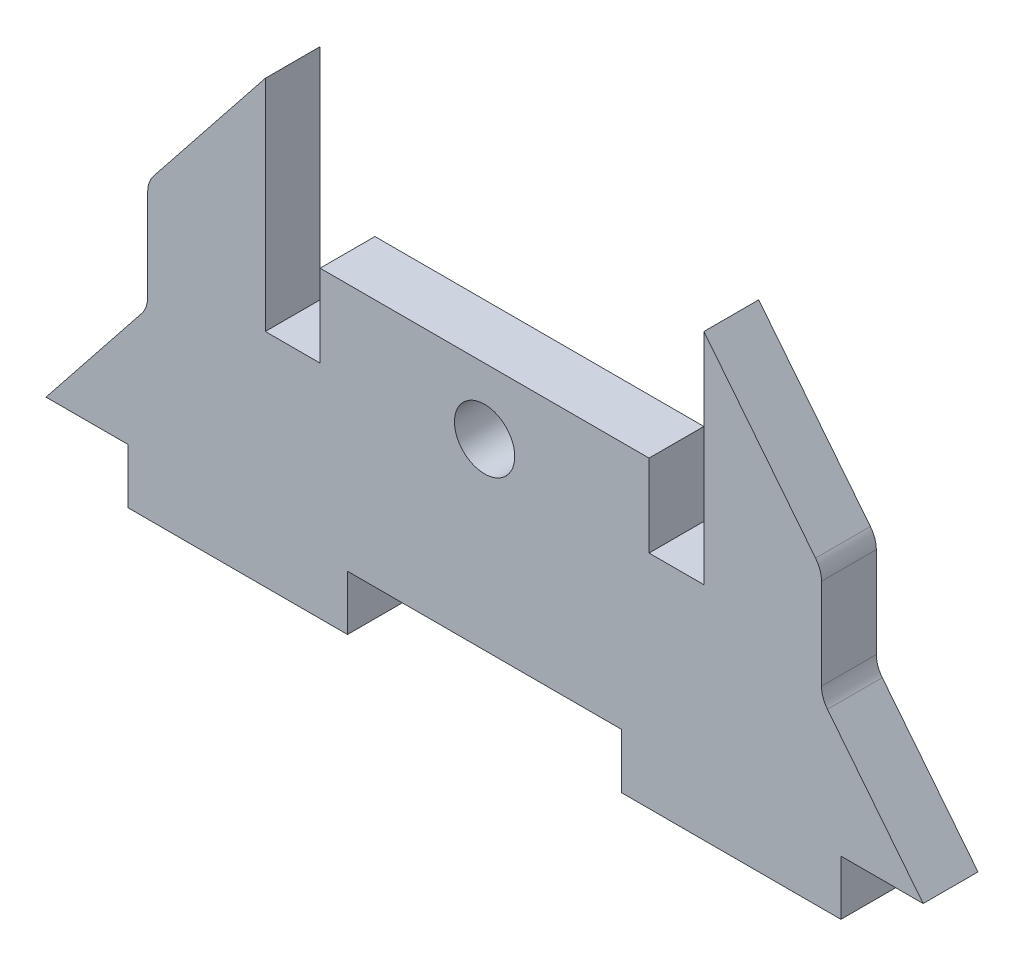
ISO-10303-21;
HEADER;
FILE_DESCRIPTION(('STEP AP214'),'2;1');
FILE_NAME('part.step','',(''),(''),'','','');
FILE_SCHEMA(('AUTOMOTIVE_DESIGN { 1 0 10303 214 1 1 1 1 }'));
ENDSEC;
DATA;
#1=APPLICATION_CONTEXT('core data for automotive mechanical design processes');
#2=APPLICATION_PROTOCOL_DEFINITION('international standard','automotive_design',2000,#1);
#3=PRODUCT_CONTEXT('',#1,'mechanical');
#4=PRODUCT('Part','Part','',(#3));
#5=PRODUCT_RELATED_PRODUCT_CATEGORY('part','',(#4));
#6=PRODUCT_DEFINITION_FORMATION('','',#4);
#7=PRODUCT_DEFINITION_CONTEXT('part definition',#1,'design');
#8=PRODUCT_DEFINITION('design','',#6,#7);
#9=PRODUCT_DEFINITION_SHAPE('','',#8);
#10=(LENGTH_UNIT() NAMED_UNIT(*) SI_UNIT(.MILLI.,.METRE.));
#11=(NAMED_UNIT(*) PLANE_ANGLE_UNIT() SI_UNIT($,.RADIAN.));
#12=(NAMED_UNIT(*) SI_UNIT($,.STERADIAN.) SOLID_ANGLE_UNIT());
#13=UNCERTAINTY_MEASURE_WITH_UNIT(LENGTH_MEASURE(1.E-05),#10,'distance_accuracy_value','');
#14=(GEOMETRIC_REPRESENTATION_CONTEXT(3) GLOBAL_UNCERTAINTY_ASSIGNED_CONTEXT((#13)) GLOBAL_UNIT_ASSIGNED_CONTEXT((#10,
#11,#12)) REPRESENTATION_CONTEXT('',''));
#15=CARTESIAN_POINT('',(0.,0.,0.));
#16=DIRECTION('',(0.,0.,1.));
#17=DIRECTION('',(1.,0.,0.));
#18=AXIS2_PLACEMENT_3D('',#15,#16,#17);
#19=CARTESIAN_POINT('',(-13.2909899684622,-1.66008532234719,2.));
#20=DIRECTION('',(0.,0.,1.));
#21=DIRECTION('',(1.,0.,0.));
#22=AXIS2_PLACEMENT_3D('',#19,#20,#21);
#23=PLANE('',#22);
#24=CARTESIAN_POINT('',(-13.2909899684622,-1.66008532234719,2.));
#25=DIRECTION('',(0.,0.,-1.));
#26=DIRECTION('',(1.,0.,0.));
#27=AXIS2_PLACEMENT_3D('',#24,#25,#26);
#28=CIRCLE('',#27,0.999999999999997);
#29=CARTESIAN_POINT('',(-12.2909899684622,-1.66008532234719,2.));
#30=VERTEX_POINT('',#29);
#31=CARTESIAN_POINT('',(-12.5082551235292,-2.28244065696539,2.));
#32=VERTEX_POINT('',#31);
#33=EDGE_CURVE('E294',#30,#32,#28,.T.);
#34=ORIENTED_EDGE('',*,*,#33,.T.);
#35=DIRECTION('',(-0.622355334618193,-0.782734844932993,0.));
#36=VECTOR('',#35,1.);
#37=CARTESIAN_POINT('',(-12.5082551235292,-2.28244065696539,2.));
#38=LINE('',#37,#36);
#39=CARTESIAN_POINT('',(-16.,-6.67399999999999,2.));
#40=VERTEX_POINT('',#39);
#41=EDGE_CURVE('E150',#32,#40,#38,.T.);
#42=ORIENTED_EDGE('',*,*,#41,.T.);
#43=DIRECTION('',(1.,0.,0.));
#44=VECTOR('',#43,1.);
#45=CARTESIAN_POINT('',(-13.,-6.67399999999999,2.));
#46=LINE('',#45,#44);
#47=CARTESIAN_POINT('',(-13.,-6.67399999999999,2.));
#48=VERTEX_POINT('',#47);
#49=EDGE_CURVE('E363',#40,#48,#46,.T.);
#50=ORIENTED_EDGE('',*,*,#49,.T.);
#51=DIRECTION('',(0.,-1.,0.));
#52=VECTOR('',#51,1.);
#53=CARTESIAN_POINT('',(-13.,-8.67399999999998,2.));
#54=LINE('',#53,#52);
#55=CARTESIAN_POINT('',(-13.,-8.67399999999998,2.));
#56=VERTEX_POINT('',#55);
#57=EDGE_CURVE('E382',#48,#56,#54,.T.);
#58=ORIENTED_EDGE('',*,*,#57,.T.);
#59=DIRECTION('',(1.,0.,0.));
#60=VECTOR('',#59,1.);
#61=CARTESIAN_POINT('',(-5.,-8.67399999999998,2.));
#62=LINE('',#61,#60);
#63=CARTESIAN_POINT('',(-5.,-8.67399999999998,2.));
#64=VERTEX_POINT('',#63);
#65=EDGE_CURVE('E379',#56,#64,#62,.T.);
#66=ORIENTED_EDGE('',*,*,#65,.T.);
#67=DIRECTION('',(0.,1.,0.));
#68=VECTOR('',#67,1.);
#69=CARTESIAN_POINT('',(-5.,-8.67399999999998,2.));
#70=LINE('',#69,#68);
#71=CARTESIAN_POINT('',(-5.,-6.67399999999998,2.));
#72=VERTEX_POINT('',#71);
#73=EDGE_CURVE('E381',#64,#72,#70,.T.);
#74=ORIENTED_EDGE('',*,*,#73,.T.);
#75=DIRECTION('',(1.,0.,0.));
#76=VECTOR('',#75,1.);
#77=CARTESIAN_POINT('',(5.,-6.67399999999998,2.));
#78=LINE('',#77,#76);
#79=CARTESIAN_POINT('',(5.,-6.67399999999998,2.));
#80=VERTEX_POINT('',#79);
#81=EDGE_CURVE('E384',#72,#80,#78,.T.);
#82=ORIENTED_EDGE('',*,*,#81,.T.);
#83=DIRECTION('',(0.,-1.,0.));
#84=VECTOR('',#83,1.);
#85=CARTESIAN_POINT('',(5.,-8.67399999999998,2.));
#86=LINE('',#85,#84);
#87=CARTESIAN_POINT('',(5.,-8.67399999999998,2.));
#88=VERTEX_POINT('',#87);
#89=EDGE_CURVE('E390',#80,#88,#86,.T.);
#90=ORIENTED_EDGE('',*,*,#89,.T.);
#91=DIRECTION('',(1.,0.,0.));
#92=VECTOR('',#91,1.);
#93=CARTESIAN_POINT('',(5.,-8.67399999999998,2.));
#94=LINE('',#93,#92);
#95=CARTESIAN_POINT('',(13.,-8.67399999999998,2.));
#96=VERTEX_POINT('',#95);
#97=EDGE_CURVE('E392',#88,#96,#94,.T.);
#98=ORIENTED_EDGE('',*,*,#97,.T.);
#99=DIRECTION('',(0.,1.,0.));
#100=VECTOR('',#99,1.);
#101=CARTESIAN_POINT('',(13.,-8.67399999999998,2.));
#102=LINE('',#101,#100);
#103=CARTESIAN_POINT('',(13.,-6.67399999999999,2.));
#104=VERTEX_POINT('',#103);
#105=EDGE_CURVE('E394',#96,#104,#102,.T.);
#106=ORIENTED_EDGE('',*,*,#105,.T.);
#107=DIRECTION('',(1.,0.,0.));
#108=VECTOR('',#107,1.);
#109=CARTESIAN_POINT('',(13.,-6.67399999999999,2.));
#110=LINE('',#109,#108);
#111=CARTESIAN_POINT('',(16.,-6.67399999999999,2.));
#112=VERTEX_POINT('',#111);
#113=EDGE_CURVE('E396',#104,#112,#110,.T.);
#114=ORIENTED_EDGE('',*,*,#113,.T.);
#115=DIRECTION('',(-0.622355334618194,0.782734844932993,0.));
#116=VECTOR('',#115,1.);
#117=CARTESIAN_POINT('',(12.5082551235292,-2.28244065696539,2.));
#118=LINE('',#117,#116);
#119=CARTESIAN_POINT('',(12.5082551235292,-2.28244065696539,2.));
#120=VERTEX_POINT('',#119);
#121=EDGE_CURVE('E398',#112,#120,#118,.T.);
#122=ORIENTED_EDGE('',*,*,#121,.T.);
#123=CARTESIAN_POINT('',(13.2909899684622,-1.66008532234719,2.));
#124=DIRECTION('',(0.,0.,-1.));
#125=DIRECTION('',(1.,0.,0.));
#126=AXIS2_PLACEMENT_3D('',#123,#124,#125);
#127=CIRCLE('',#126,0.999999999999998);
#128=CARTESIAN_POINT('',(12.2909899684622,-1.66008532234719,2.));
#129=VERTEX_POINT('',#128);
#130=EDGE_CURVE('E400',#120,#129,#127,.T.);
#131=ORIENTED_EDGE('',*,*,#130,.T.);
#132=DIRECTION('',(0.,1.,0.));
#133=VECTOR('',#132,1.);
#134=CARTESIAN_POINT('',(12.2909899684622,1.6541305204139,2.));
#135=LINE('',#134,#133);
#136=CARTESIAN_POINT('',(12.2909899684622,1.6541305204139,2.));
#137=VERTEX_POINT('',#136);
#138=EDGE_CURVE('E402',#129,#137,#135,.T.);
#139=ORIENTED_EDGE('',*,*,#138,.T.);
#140=CARTESIAN_POINT('',(11.2909899684622,1.6541305204139,2.));
#141=DIRECTION('',(0.,0.,1.));
#142=DIRECTION('',(-1.,0.,0.));
#143=AXIS2_PLACEMENT_3D('',#140,#141,#142);
#144=CIRCLE('',#143,0.999999999999999);
#145=CARTESIAN_POINT('',(12.0737248133952,2.2764858550321,2.));
#146=VERTEX_POINT('',#145);
#147=EDGE_CURVE('E404',#137,#146,#144,.T.);
#148=ORIENTED_EDGE('',*,*,#147,.T.);
#149=DIRECTION('',(-0.622355334618194,0.782734844932993,0.));
#150=VECTOR('',#149,1.);
#151=CARTESIAN_POINT('',(8.,7.40000000000001,2.));
#152=LINE('',#151,#150);
#153=CARTESIAN_POINT('',(8.,7.40000000000001,2.));
#154=VERTEX_POINT('',#153);
#155=EDGE_CURVE('E406',#146,#154,#152,.T.);
#156=ORIENTED_EDGE('',*,*,#155,.T.);
#157=DIRECTION('',(0.,-1.,0.));
#158=VECTOR('',#157,1.);
#159=CARTESIAN_POINT('',(8.,2.40000000000001,2.));
#160=LINE('',#159,#158);
#161=CARTESIAN_POINT('',(8.,-0.599999999999988,2.));
#162=VERTEX_POINT('',#161);
#163=EDGE_CURVE('E408',#154,#162,#160,.T.);
#164=ORIENTED_EDGE('',*,*,#163,.T.);
#165=DIRECTION('',(-1.,0.,0.));
#166=VECTOR('',#165,1.);
#167=CARTESIAN_POINT('',(8.,-0.599999999999988,2.));
#168=LINE('',#167,#166);
#169=CARTESIAN_POINT('',(6.,-0.599999999999988,2.));
#170=VERTEX_POINT('',#169);
#171=EDGE_CURVE('E410',#162,#170,#168,.T.);
#172=ORIENTED_EDGE('',*,*,#171,.T.);
#173=DIRECTION('',(0.,1.,0.));
#174=VECTOR('',#173,1.);
#175=CARTESIAN_POINT('',(6.,-0.599999999999988,2.));
#176=LINE('',#175,#174);
#177=CARTESIAN_POINT('',(6.,2.40000000000001,2.));
#178=VERTEX_POINT('',#177);
#179=EDGE_CURVE('E412',#170,#178,#176,.T.);
#180=ORIENTED_EDGE('',*,*,#179,.T.);
#181=DIRECTION('',(-1.,0.,0.));
#182=VECTOR('',#181,1.);
#183=CARTESIAN_POINT('',(6.,2.40000000000001,2.));
#184=LINE('',#183,#182);
#185=CARTESIAN_POINT('',(-6.,2.40000000000001,2.));
#186=VERTEX_POINT('',#185);
#187=EDGE_CURVE('E414',#178,#186,#184,.T.);
#188=ORIENTED_EDGE('',*,*,#187,.T.);
#189=DIRECTION('',(0.,-1.,0.));
#190=VECTOR('',#189,1.);
#191=CARTESIAN_POINT('',(-6.,-0.599999999999988,2.));
#192=LINE('',#191,#190);
#193=CARTESIAN_POINT('',(-6.,-0.599999999999988,2.));
#194=VERTEX_POINT('',#193);
#195=EDGE_CURVE('E416',#186,#194,#192,.T.);
#196=ORIENTED_EDGE('',*,*,#195,.T.);
#197=DIRECTION('',(-1.,0.,0.));
#198=VECTOR('',#197,1.);
#199=CARTESIAN_POINT('',(-8.,-0.599999999999988,2.));
#200=LINE('',#199,#198);
#201=CARTESIAN_POINT('',(-8.,-0.599999999999988,2.));
#202=VERTEX_POINT('',#201);
#203=EDGE_CURVE('E418',#194,#202,#200,.T.);
#204=ORIENTED_EDGE('',*,*,#203,.T.);
#205=DIRECTION('',(0.,1.,0.));
#206=VECTOR('',#205,1.);
#207=CARTESIAN_POINT('',(-8.,2.40000000000001,2.));
#208=LINE('',#207,#206);
#209=CARTESIAN_POINT('',(-8.,7.40000000000001,2.));
#210=VERTEX_POINT('',#209);
#211=EDGE_CURVE('E223',#202,#210,#208,.T.);
#212=ORIENTED_EDGE('',*,*,#211,.T.);
#213=DIRECTION('',(-0.622355334618193,-0.782734844932993,0.));
#214=VECTOR('',#213,1.);
#215=CARTESIAN_POINT('',(-8.,7.40000000000001,2.));
#216=LINE('',#215,#214);
#217=CARTESIAN_POINT('',(-12.0737248133952,2.27648585503209,2.));
#218=VERTEX_POINT('',#217);
#219=EDGE_CURVE('E217',#210,#218,#216,.T.);
#220=ORIENTED_EDGE('',*,*,#219,.T.);
#221=CARTESIAN_POINT('',(-11.2909899684622,1.6541305204139,2.));
#222=DIRECTION('',(0.,0.,1.));
#223=DIRECTION('',(-1.,0.,0.));
#224=AXIS2_PLACEMENT_3D('',#221,#222,#223);
#225=CIRCLE('',#224,0.999999999999999);
#226=CARTESIAN_POINT('',(-12.2909899684622,1.6541305204139,2.));
#227=VERTEX_POINT('',#226);
#228=EDGE_CURVE('E221',#218,#227,#225,.T.);
#229=ORIENTED_EDGE('',*,*,#228,.T.);
#230=DIRECTION('',(0.,-1.,0.));
#231=VECTOR('',#230,1.);
#232=CARTESIAN_POINT('',(-12.2909899684622,1.6541305204139,2.));
#233=LINE('',#232,#231);
#234=EDGE_CURVE('E53',#227,#30,#233,.T.);
#235=ORIENTED_EDGE('',*,*,#234,.T.);
#236=EDGE_LOOP('',(#34,#42,#50,#58,#66,#74,#82,#90,#98,#106,#114,#122,#131,#139,#148,#156,#164,
#172,#180,#188,#196,#204,#212,#220,#229,#235));
#237=FACE_BOUND('',#236,.T.);
#238=CARTESIAN_POINT('',(0.,0.,2.));
#239=DIRECTION('',(0.,0.,1.));
#240=DIRECTION('',(1.,0.,0.));
#241=AXIS2_PLACEMENT_3D('',#238,#239,#240);
#242=CIRCLE('',#241,1.09999999999999);
#243=CARTESIAN_POINT('',(1.09999999999999,0.,2.));
#244=VERTEX_POINT('',#243);
#245=EDGE_CURVE('E245',#244,#244,#242,.T.);
#246=ORIENTED_EDGE('',*,*,#245,.F.);
#247=EDGE_LOOP('',(#246));
#248=FACE_BOUND('',#247,.T.);
#249=ADVANCED_FACE('F36',(#237,#248),#23,.T.);
#250=CARTESIAN_POINT('',(-13.2909899684622,-1.66008532234719,0.));
#251=DIRECTION('',(0.,0.,1.));
#252=DIRECTION('',(1.,0.,0.));
#253=AXIS2_PLACEMENT_3D('',#250,#251,#252);
#254=PLANE('',#253);
#255=CARTESIAN_POINT('',(-13.2909899684622,-1.66008532234719,0.));
#256=DIRECTION('',(0.,0.,-1.));
#257=DIRECTION('',(1.,0.,0.));
#258=AXIS2_PLACEMENT_3D('',#255,#256,#257);
#259=CIRCLE('',#258,0.999999999999997);
#260=CARTESIAN_POINT('',(-12.2909899684622,-1.66008532234719,0.));
#261=VERTEX_POINT('',#260);
#262=CARTESIAN_POINT('',(-12.5082551235292,-2.28244065696539,0.));
#263=VERTEX_POINT('',#262);
#264=EDGE_CURVE('E241',#261,#263,#259,.T.);
#265=ORIENTED_EDGE('',*,*,#264,.F.);
#266=DIRECTION('',(0.,-1.,0.));
#267=VECTOR('',#266,1.);
#268=CARTESIAN_POINT('',(-12.2909899684622,1.6541305204139,0.));
#269=LINE('',#268,#267);
#270=CARTESIAN_POINT('',(-12.2909899684622,1.6541305204139,0.));
#271=VERTEX_POINT('',#270);
#272=EDGE_CURVE('E142',#271,#261,#269,.T.);
#273=ORIENTED_EDGE('',*,*,#272,.F.);
#274=CARTESIAN_POINT('',(-11.2909899684622,1.6541305204139,0.));
#275=DIRECTION('',(0.,0.,1.));
#276=DIRECTION('',(-1.,0.,0.));
#277=AXIS2_PLACEMENT_3D('',#274,#275,#276);
#278=CIRCLE('',#277,0.999999999999999);
#279=CARTESIAN_POINT('',(-12.0737248133952,2.27648585503209,0.));
#280=VERTEX_POINT('',#279);
#281=EDGE_CURVE('E136',#280,#271,#278,.T.);
#282=ORIENTED_EDGE('',*,*,#281,.F.);
#283=DIRECTION('',(-0.622355334618193,-0.782734844932993,0.));
#284=VECTOR('',#283,1.);
#285=CARTESIAN_POINT('',(-8.,7.40000000000001,0.));
#286=LINE('',#285,#284);
#287=CARTESIAN_POINT('',(-8.,7.40000000000001,0.));
#288=VERTEX_POINT('',#287);
#289=EDGE_CURVE('E231',#288,#280,#286,.T.);
#290=ORIENTED_EDGE('',*,*,#289,.F.);
#291=DIRECTION('',(0.,1.,0.));
#292=VECTOR('',#291,1.);
#293=CARTESIAN_POINT('',(-8.,2.40000000000001,0.));
#294=LINE('',#293,#292);
#295=CARTESIAN_POINT('',(-8.,-0.599999999999988,0.));
#296=VERTEX_POINT('',#295);
#297=EDGE_CURVE('E289',#296,#288,#294,.T.);
#298=ORIENTED_EDGE('',*,*,#297,.F.);
#299=DIRECTION('',(-1.,0.,0.));
#300=VECTOR('',#299,1.);
#301=CARTESIAN_POINT('',(-8.,-0.599999999999988,0.));
#302=LINE('',#301,#300);
#303=CARTESIAN_POINT('',(-6.,-0.599999999999988,0.));
#304=VERTEX_POINT('',#303);
#305=EDGE_CURVE('E286',#304,#296,#302,.T.);
#306=ORIENTED_EDGE('',*,*,#305,.F.);
#307=DIRECTION('',(0.,-1.,0.));
#308=VECTOR('',#307,1.);
#309=CARTESIAN_POINT('',(-6.,-0.599999999999988,0.));
#310=LINE('',#309,#308);
#311=CARTESIAN_POINT('',(-6.,2.40000000000001,0.));
#312=VERTEX_POINT('',#311);
#313=EDGE_CURVE('E284',#312,#304,#310,.T.);
#314=ORIENTED_EDGE('',*,*,#313,.F.);
#315=DIRECTION('',(-1.,0.,0.));
#316=VECTOR('',#315,1.);
#317=CARTESIAN_POINT('',(6.,2.40000000000001,0.));
#318=LINE('',#317,#316);
#319=CARTESIAN_POINT('',(6.,2.40000000000001,0.));
#320=VERTEX_POINT('',#319);
#321=EDGE_CURVE('E282',#320,#312,#318,.T.);
#322=ORIENTED_EDGE('',*,*,#321,.F.);
#323=DIRECTION('',(0.,1.,0.));
#324=VECTOR('',#323,1.);
#325=CARTESIAN_POINT('',(6.,-0.599999999999988,0.));
#326=LINE('',#325,#324);
#327=CARTESIAN_POINT('',(6.,-0.599999999999988,0.));
#328=VERTEX_POINT('',#327);
#329=EDGE_CURVE('E280',#328,#320,#326,.T.);
#330=ORIENTED_EDGE('',*,*,#329,.F.);
#331=DIRECTION('',(-1.,0.,0.));
#332=VECTOR('',#331,1.);
#333=CARTESIAN_POINT('',(8.,-0.599999999999988,0.));
#334=LINE('',#333,#332);
#335=CARTESIAN_POINT('',(8.,-0.599999999999988,0.));
#336=VERTEX_POINT('',#335);
#337=EDGE_CURVE('E278',#336,#328,#334,.T.);
#338=ORIENTED_EDGE('',*,*,#337,.F.);
#339=DIRECTION('',(0.,-1.,0.));
#340=VECTOR('',#339,1.);
#341=CARTESIAN_POINT('',(8.,2.40000000000001,0.));
#342=LINE('',#341,#340);
#343=CARTESIAN_POINT('',(8.,7.40000000000001,0.));
#344=VERTEX_POINT('',#343);
#345=EDGE_CURVE('E276',#344,#336,#342,.T.);
#346=ORIENTED_EDGE('',*,*,#345,.F.);
#347=DIRECTION('',(-0.622355334618194,0.782734844932993,0.));
#348=VECTOR('',#347,1.);
#349=CARTESIAN_POINT('',(8.,7.40000000000001,0.));
#350=LINE('',#349,#348);
#351=CARTESIAN_POINT('',(12.0737248133952,2.2764858550321,0.));
#352=VERTEX_POINT('',#351);
#353=EDGE_CURVE('E273',#352,#344,#350,.T.);
#354=ORIENTED_EDGE('',*,*,#353,.F.);
#355=CARTESIAN_POINT('',(11.2909899684622,1.6541305204139,0.));
#356=DIRECTION('',(0.,0.,1.));
#357=DIRECTION('',(-1.,0.,0.));
#358=AXIS2_PLACEMENT_3D('',#355,#356,#357);
#359=CIRCLE('',#358,0.999999999999999);
#360=CARTESIAN_POINT('',(12.2909899684622,1.6541305204139,0.));
#361=VERTEX_POINT('',#360);
#362=EDGE_CURVE('E271',#361,#352,#359,.T.);
#363=ORIENTED_EDGE('',*,*,#362,.F.);
#364=DIRECTION('',(0.,1.,0.));
#365=VECTOR('',#364,1.);
#366=CARTESIAN_POINT('',(12.2909899684622,1.6541305204139,0.));
#367=LINE('',#366,#365);
#368=CARTESIAN_POINT('',(12.2909899684622,-1.66008532234719,0.));
#369=VERTEX_POINT('',#368);
#370=EDGE_CURVE('E269',#369,#361,#367,.T.);
#371=ORIENTED_EDGE('',*,*,#370,.F.);
#372=CARTESIAN_POINT('',(13.2909899684622,-1.66008532234719,0.));
#373=DIRECTION('',(0.,0.,-1.));
#374=DIRECTION('',(1.,0.,0.));
#375=AXIS2_PLACEMENT_3D('',#372,#373,#374);
#376=CIRCLE('',#375,0.999999999999998);
#377=CARTESIAN_POINT('',(12.5082551235292,-2.28244065696539,0.));
#378=VERTEX_POINT('',#377);
#379=EDGE_CURVE('E267',#378,#369,#376,.T.);
#380=ORIENTED_EDGE('',*,*,#379,.F.);
#381=DIRECTION('',(-0.622355334618194,0.782734844932993,0.));
#382=VECTOR('',#381,1.);
#383=CARTESIAN_POINT('',(12.5082551235292,-2.28244065696539,0.));
#384=LINE('',#383,#382);
#385=CARTESIAN_POINT('',(16.,-6.67399999999999,0.));
#386=VERTEX_POINT('',#385);
#387=EDGE_CURVE('E265',#386,#378,#384,.T.);
#388=ORIENTED_EDGE('',*,*,#387,.F.);
#389=DIRECTION('',(1.,0.,0.));
#390=VECTOR('',#389,1.);
#391=CARTESIAN_POINT('',(13.,-6.67399999999999,0.));
#392=LINE('',#391,#390);
#393=CARTESIAN_POINT('',(13.,-6.67399999999999,0.));
#394=VERTEX_POINT('',#393);
#395=EDGE_CURVE('E263',#394,#386,#392,.T.);
#396=ORIENTED_EDGE('',*,*,#395,.F.);
#397=DIRECTION('',(0.,1.,0.));
#398=VECTOR('',#397,1.);
#399=CARTESIAN_POINT('',(13.,-8.67399999999998,0.));
#400=LINE('',#399,#398);
#401=CARTESIAN_POINT('',(13.,-8.67399999999998,0.));
#402=VERTEX_POINT('',#401);
#403=EDGE_CURVE('E261',#402,#394,#400,.T.);
#404=ORIENTED_EDGE('',*,*,#403,.F.);
#405=DIRECTION('',(1.,0.,0.));
#406=VECTOR('',#405,1.);
#407=CARTESIAN_POINT('',(5.,-8.67399999999998,0.));
#408=LINE('',#407,#406);
#409=CARTESIAN_POINT('',(5.,-8.67399999999998,0.));
#410=VERTEX_POINT('',#409);
#411=EDGE_CURVE('E259',#410,#402,#408,.T.);
#412=ORIENTED_EDGE('',*,*,#411,.F.);
#413=DIRECTION('',(0.,-1.,0.));
#414=VECTOR('',#413,1.);
#415=CARTESIAN_POINT('',(5.,-8.67399999999998,0.));
#416=LINE('',#415,#414);
#417=CARTESIAN_POINT('',(5.,-6.67399999999998,0.));
#418=VERTEX_POINT('',#417);
#419=EDGE_CURVE('E257',#418,#410,#416,.T.);
#420=ORIENTED_EDGE('',*,*,#419,.F.);
#421=DIRECTION('',(1.,0.,0.));
#422=VECTOR('',#421,1.);
#423=CARTESIAN_POINT('',(5.,-6.67399999999998,0.));
#424=LINE('',#423,#422);
#425=CARTESIAN_POINT('',(-5.,-6.67399999999998,0.));
#426=VERTEX_POINT('',#425);
#427=EDGE_CURVE('E255',#426,#418,#424,.T.);
#428=ORIENTED_EDGE('',*,*,#427,.F.);
#429=DIRECTION('',(0.,1.,0.));
#430=VECTOR('',#429,1.);
#431=CARTESIAN_POINT('',(-5.,-8.67399999999998,0.));
#432=LINE('',#431,#430);
#433=CARTESIAN_POINT('',(-5.,-8.67399999999998,0.));
#434=VERTEX_POINT('',#433);
#435=EDGE_CURVE('E253',#434,#426,#432,.T.);
#436=ORIENTED_EDGE('',*,*,#435,.F.);
#437=DIRECTION('',(1.,0.,0.));
#438=VECTOR('',#437,1.);
#439=CARTESIAN_POINT('',(-5.,-8.67399999999998,0.));
#440=LINE('',#439,#438);
#441=CARTESIAN_POINT('',(-13.,-8.67399999999998,0.));
#442=VERTEX_POINT('',#441);
#443=EDGE_CURVE('E251',#442,#434,#440,.T.);
#444=ORIENTED_EDGE('',*,*,#443,.F.);
#445=DIRECTION('',(0.,-1.,0.));
#446=VECTOR('',#445,1.);
#447=CARTESIAN_POINT('',(-13.,-8.67399999999998,0.));
#448=LINE('',#447,#446);
#449=CARTESIAN_POINT('',(-13.,-6.67399999999999,0.));
#450=VERTEX_POINT('',#449);
#451=EDGE_CURVE('E249',#450,#442,#448,.T.);
#452=ORIENTED_EDGE('',*,*,#451,.F.);
#453=DIRECTION('',(1.,0.,0.));
#454=VECTOR('',#453,1.);
#455=CARTESIAN_POINT('',(-13.,-6.67399999999999,0.));
#456=LINE('',#455,#454);
#457=CARTESIAN_POINT('',(-16.,-6.67399999999999,0.));
#458=VERTEX_POINT('',#457);
#459=EDGE_CURVE('E247',#458,#450,#456,.T.);
#460=ORIENTED_EDGE('',*,*,#459,.F.);
#461=DIRECTION('',(-0.622355334618193,-0.782734844932993,0.));
#462=VECTOR('',#461,1.);
#463=CARTESIAN_POINT('',(-12.5082551235292,-2.28244065696539,0.));
#464=LINE('',#463,#462);
#465=EDGE_CURVE('E244',#263,#458,#464,.T.);
#466=ORIENTED_EDGE('',*,*,#465,.F.);
#467=EDGE_LOOP('',(#265,#273,#282,#290,#298,#306,#314,#322,#330,#338,#346,#354,#363,#371,#380,
#388,#396,#404,#412,#420,#428,#436,#444,#452,#460,#466));
#468=FACE_BOUND('',#467,.T.);
#469=CARTESIAN_POINT('',(0.,0.,0.));
#470=DIRECTION('',(0.,0.,1.));
#471=DIRECTION('',(1.,0.,0.));
#472=AXIS2_PLACEMENT_3D('',#469,#470,#471);
#473=CIRCLE('',#472,1.09999999999999);
#474=CARTESIAN_POINT('',(1.09999999999999,0.,0.));
#475=VERTEX_POINT('',#474);
#476=EDGE_CURVE('E751',#475,#475,#473,.T.);
#477=ORIENTED_EDGE('',*,*,#476,.T.);
#478=EDGE_LOOP('',(#477));
#479=FACE_BOUND('',#478,.T.);
#480=ADVANCED_FACE('F367',(#468,#479),#254,.F.);
#481=CARTESIAN_POINT('',(-13.2909899684622,-1.66008532234719,2.));
#482=DIRECTION('',(0.,0.,-1.));
#483=DIRECTION('',(-1.,0.,0.));
#484=AXIS2_PLACEMENT_3D('',#481,#482,#483);
#485=CYLINDRICAL_SURFACE('',#484,0.999999999999997);
#486=ORIENTED_EDGE('',*,*,#264,.T.);
#487=DIRECTION('',(0.,0.,-1.));
#488=VECTOR('',#487,1.);
#489=CARTESIAN_POINT('',(-12.5082551235292,-2.28244065696539,2.));
#490=LINE('',#489,#488);
#491=EDGE_CURVE('E11',#32,#263,#490,.T.);
#492=ORIENTED_EDGE('',*,*,#491,.F.);
#493=ORIENTED_EDGE('',*,*,#33,.F.);
#494=DIRECTION('',(0.,0.,-1.));
#495=VECTOR('',#494,1.);
#496=CARTESIAN_POINT('',(-12.2909899684622,-1.66008532234719,2.));
#497=LINE('',#496,#495);
#498=EDGE_CURVE('E237',#30,#261,#497,.T.);
#499=ORIENTED_EDGE('',*,*,#498,.T.);
#500=EDGE_LOOP('',(#486,#492,#493,#499));
#501=FACE_BOUND('',#500,.T.);
#502=ADVANCED_FACE('F38',(#501),#485,.F.);
#503=CARTESIAN_POINT('',(-12.5082551235292,-2.28244065696539,2.));
#504=DIRECTION('',(0.782734844932993,-0.622355334618193,0.));
#505=DIRECTION('',(0.622355334618193,0.782734844932993,0.));
#506=AXIS2_PLACEMENT_3D('',#503,#504,#505);
#507=PLANE('',#506);
#508=ORIENTED_EDGE('',*,*,#465,.T.);
#509=DIRECTION('',(0.,0.,-1.));
#510=VECTOR('',#509,1.);
#511=CARTESIAN_POINT('',(-16.,-6.67399999999999,2.));
#512=LINE('',#511,#510);
#513=EDGE_CURVE('E45',#40,#458,#512,.T.);
#514=ORIENTED_EDGE('',*,*,#513,.F.);
#515=ORIENTED_EDGE('',*,*,#41,.F.);
#516=ORIENTED_EDGE('',*,*,#491,.T.);
#517=EDGE_LOOP('',(#508,#514,#515,#516));
#518=FACE_BOUND('',#517,.T.);
#519=ADVANCED_FACE('F451',(#518),#507,.F.);
#520=CARTESIAN_POINT('',(-13.,-6.67399999999999,2.));
#521=DIRECTION('',(0.,1.,0.));
#522=DIRECTION('',(0.,0.,1.));
#523=AXIS2_PLACEMENT_3D('',#520,#521,#522);
#524=PLANE('',#523);
#525=ORIENTED_EDGE('',*,*,#459,.T.);
#526=DIRECTION('',(0.,0.,-1.));
#527=VECTOR('',#526,1.);
#528=CARTESIAN_POINT('',(-13.,-6.67399999999999,2.));
#529=LINE('',#528,#527);
#530=EDGE_CURVE('E355',#48,#450,#529,.T.);
#531=ORIENTED_EDGE('',*,*,#530,.F.);
#532=ORIENTED_EDGE('',*,*,#49,.F.);
#533=ORIENTED_EDGE('',*,*,#513,.T.);
#534=EDGE_LOOP('',(#525,#531,#532,#533));
#535=FACE_BOUND('',#534,.T.);
#536=ADVANCED_FACE('F361',(#535),#524,.F.);
#537=CARTESIAN_POINT('',(-13.,-8.67399999999998,2.));
#538=DIRECTION('',(1.,0.,0.));
#539=DIRECTION('',(0.,1.,0.));
#540=AXIS2_PLACEMENT_3D('',#537,#538,#539);
#541=PLANE('',#540);
#542=ORIENTED_EDGE('',*,*,#451,.T.);
#543=DIRECTION('',(0.,0.,-1.));
#544=VECTOR('',#543,1.);
#545=CARTESIAN_POINT('',(-13.,-8.67399999999998,2.));
#546=LINE('',#545,#544);
#547=EDGE_CURVE('E352',#56,#442,#546,.T.);
#548=ORIENTED_EDGE('',*,*,#547,.F.);
#549=ORIENTED_EDGE('',*,*,#57,.F.);
#550=ORIENTED_EDGE('',*,*,#530,.T.);
#551=EDGE_LOOP('',(#542,#548,#549,#550));
#552=FACE_BOUND('',#551,.T.);
#553=ADVANCED_FACE('F373',(#552),#541,.F.);
#554=CARTESIAN_POINT('',(-5.,-8.67399999999998,2.));
#555=DIRECTION('',(0.,1.,0.));
#556=DIRECTION('',(0.,0.,1.));
#557=AXIS2_PLACEMENT_3D('',#554,#555,#556);
#558=PLANE('',#557);
#559=ORIENTED_EDGE('',*,*,#443,.T.);
#560=DIRECTION('',(0.,0.,-1.));
#561=VECTOR('',#560,1.);
#562=CARTESIAN_POINT('',(-5.,-8.67399999999998,2.));
#563=LINE('',#562,#561);
#564=EDGE_CURVE('E349',#64,#434,#563,.T.);
#565=ORIENTED_EDGE('',*,*,#564,.F.);
#566=ORIENTED_EDGE('',*,*,#65,.F.);
#567=ORIENTED_EDGE('',*,*,#547,.T.);
#568=EDGE_LOOP('',(#559,#565,#566,#567));
#569=FACE_BOUND('',#568,.T.);
#570=ADVANCED_FACE('F377',(#569),#558,.F.);
#571=CARTESIAN_POINT('',(-5.,-8.67399999999998,2.));
#572=DIRECTION('',(-1.,0.,0.));
#573=DIRECTION('',(0.,0.,1.));
#574=AXIS2_PLACEMENT_3D('',#571,#572,#573);
#575=PLANE('',#574);
#576=ORIENTED_EDGE('',*,*,#435,.T.);
#577=DIRECTION('',(0.,0.,-1.));
#578=VECTOR('',#577,1.);
#579=CARTESIAN_POINT('',(-5.,-6.67399999999998,2.));
#580=LINE('',#579,#578);
#581=EDGE_CURVE('E346',#72,#426,#580,.T.);
#582=ORIENTED_EDGE('',*,*,#581,.F.);
#583=ORIENTED_EDGE('',*,*,#73,.F.);
#584=ORIENTED_EDGE('',*,*,#564,.T.);
#585=EDGE_LOOP('',(#576,#582,#583,#584));
#586=FACE_BOUND('',#585,.T.);
#587=ADVANCED_FACE('F464',(#586),#575,.F.);
#588=CARTESIAN_POINT('',(5.,-6.67399999999998,2.));
#589=DIRECTION('',(0.,1.,0.));
#590=DIRECTION('',(0.,0.,1.));
#591=AXIS2_PLACEMENT_3D('',#588,#589,#590);
#592=PLANE('',#591);
#593=ORIENTED_EDGE('',*,*,#427,.T.);
#594=DIRECTION('',(0.,0.,-1.));
#595=VECTOR('',#594,1.);
#596=CARTESIAN_POINT('',(5.,-6.67399999999998,2.));
#597=LINE('',#596,#595);
#598=EDGE_CURVE('E343',#80,#418,#597,.T.);
#599=ORIENTED_EDGE('',*,*,#598,.F.);
#600=ORIENTED_EDGE('',*,*,#81,.F.);
#601=ORIENTED_EDGE('',*,*,#581,.T.);
#602=EDGE_LOOP('',(#593,#599,#600,#601));
#603=FACE_BOUND('',#602,.T.);
#604=ADVANCED_FACE('F467',(#603),#592,.F.);
#605=CARTESIAN_POINT('',(5.,-8.67399999999998,2.));
#606=DIRECTION('',(1.,0.,0.));
#607=DIRECTION('',(0.,0.,-1.));
#608=AXIS2_PLACEMENT_3D('',#605,#606,#607);
#609=PLANE('',#608);
#610=ORIENTED_EDGE('',*,*,#419,.T.);
#611=DIRECTION('',(0.,0.,-1.));
#612=VECTOR('',#611,1.);
#613=CARTESIAN_POINT('',(5.,-8.67399999999998,2.));
#614=LINE('',#613,#612);
#615=EDGE_CURVE('E340',#88,#410,#614,.T.);
#616=ORIENTED_EDGE('',*,*,#615,.F.);
#617=ORIENTED_EDGE('',*,*,#89,.F.);
#618=ORIENTED_EDGE('',*,*,#598,.T.);
#619=EDGE_LOOP('',(#610,#616,#617,#618));
#620=FACE_BOUND('',#619,.T.);
#621=ADVANCED_FACE('F471',(#620),#609,.F.);
#622=CARTESIAN_POINT('',(5.,-8.67399999999998,2.));
#623=DIRECTION('',(0.,1.,0.));
#624=DIRECTION('',(0.,0.,1.));
#625=AXIS2_PLACEMENT_3D('',#622,#623,#624);
#626=PLANE('',#625);
#627=ORIENTED_EDGE('',*,*,#411,.T.);
#628=DIRECTION('',(0.,0.,-1.));
#629=VECTOR('',#628,1.);
#630=CARTESIAN_POINT('',(13.,-8.67399999999998,2.));
#631=LINE('',#630,#629);
#632=EDGE_CURVE('E337',#96,#402,#631,.T.);
#633=ORIENTED_EDGE('',*,*,#632,.F.);
#634=ORIENTED_EDGE('',*,*,#97,.F.);
#635=ORIENTED_EDGE('',*,*,#615,.T.);
#636=EDGE_LOOP('',(#627,#633,#634,#635));
#637=FACE_BOUND('',#636,.T.);
#638=ADVANCED_FACE('F475',(#637),#626,.F.);
#639=CARTESIAN_POINT('',(13.,-8.67399999999998,2.));
#640=DIRECTION('',(-1.,0.,0.));
#641=DIRECTION('',(0.,-1.,0.));
#642=AXIS2_PLACEMENT_3D('',#639,#640,#641);
#643=PLANE('',#642);
#644=ORIENTED_EDGE('',*,*,#403,.T.);
#645=DIRECTION('',(0.,0.,-1.));
#646=VECTOR('',#645,1.);
#647=CARTESIAN_POINT('',(13.,-6.67399999999999,2.));
#648=LINE('',#647,#646);
#649=EDGE_CURVE('E334',#104,#394,#648,.T.);
#650=ORIENTED_EDGE('',*,*,#649,.F.);
#651=ORIENTED_EDGE('',*,*,#105,.F.);
#652=ORIENTED_EDGE('',*,*,#632,.T.);
#653=EDGE_LOOP('',(#644,#650,#651,#652));
#654=FACE_BOUND('',#653,.T.);
#655=ADVANCED_FACE('F479',(#654),#643,.F.);
#656=CARTESIAN_POINT('',(13.,-6.67399999999999,2.));
#657=DIRECTION('',(0.,1.,0.));
#658=DIRECTION('',(0.,0.,1.));
#659=AXIS2_PLACEMENT_3D('',#656,#657,#658);
#660=PLANE('',#659);
#661=ORIENTED_EDGE('',*,*,#395,.T.);
#662=DIRECTION('',(0.,0.,-1.));
#663=VECTOR('',#662,1.);
#664=CARTESIAN_POINT('',(16.,-6.67399999999999,2.));
#665=LINE('',#664,#663);
#666=EDGE_CURVE('E331',#112,#386,#665,.T.);
#667=ORIENTED_EDGE('',*,*,#666,.F.);
#668=ORIENTED_EDGE('',*,*,#113,.F.);
#669=ORIENTED_EDGE('',*,*,#649,.T.);
#670=EDGE_LOOP('',(#661,#667,#668,#669));
#671=FACE_BOUND('',#670,.T.);
#672=ADVANCED_FACE('F483',(#671),#660,.F.);
#673=CARTESIAN_POINT('',(12.5082551235292,-2.28244065696539,2.));
#674=DIRECTION('',(-0.782734844932993,-0.622355334618194,0.));
#675=DIRECTION('',(0.622355334618194,-0.782734844932993,0.));
#676=AXIS2_PLACEMENT_3D('',#673,#674,#675);
#677=PLANE('',#676);
#678=ORIENTED_EDGE('',*,*,#387,.T.);
#679=DIRECTION('',(0.,0.,-1.));
#680=VECTOR('',#679,1.);
#681=CARTESIAN_POINT('',(12.5082551235292,-2.28244065696539,2.));
#682=LINE('',#681,#680);
#683=EDGE_CURVE('E328',#120,#378,#682,.T.);
#684=ORIENTED_EDGE('',*,*,#683,.F.);
#685=ORIENTED_EDGE('',*,*,#121,.F.);
#686=ORIENTED_EDGE('',*,*,#666,.T.);
#687=EDGE_LOOP('',(#678,#684,#685,#686));
#688=FACE_BOUND('',#687,.T.);
#689=ADVANCED_FACE('F487',(#688),#677,.F.);
#690=CARTESIAN_POINT('',(13.2909899684622,-1.66008532234719,2.));
#691=DIRECTION('',(0.,0.,-1.));
#692=DIRECTION('',(-1.,0.,0.));
#693=AXIS2_PLACEMENT_3D('',#690,#691,#692);
#694=CYLINDRICAL_SURFACE('',#693,0.999999999999998);
#695=ORIENTED_EDGE('',*,*,#379,.T.);
#696=DIRECTION('',(0.,0.,-1.));
#697=VECTOR('',#696,1.);
#698=CARTESIAN_POINT('',(12.2909899684622,-1.66008532234719,2.));
#699=LINE('',#698,#697);
#700=EDGE_CURVE('E325',#129,#369,#699,.T.);
#701=ORIENTED_EDGE('',*,*,#700,.F.);
#702=ORIENTED_EDGE('',*,*,#130,.F.);
#703=ORIENTED_EDGE('',*,*,#683,.T.);
#704=EDGE_LOOP('',(#695,#701,#702,#703));
#705=FACE_BOUND('',#704,.T.);
#706=ADVANCED_FACE('F491',(#705),#694,.F.);
#707=CARTESIAN_POINT('',(12.2909899684622,1.6541305204139,2.));
#708=DIRECTION('',(-1.,0.,0.));
#709=DIRECTION('',(0.,-1.,0.));
#710=AXIS2_PLACEMENT_3D('',#707,#708,#709);
#711=PLANE('',#710);
#712=ORIENTED_EDGE('',*,*,#370,.T.);
#713=DIRECTION('',(0.,0.,-1.));
#714=VECTOR('',#713,1.);
#715=CARTESIAN_POINT('',(12.2909899684622,1.6541305204139,2.));
#716=LINE('',#715,#714);
#717=EDGE_CURVE('E322',#137,#361,#716,.T.);
#718=ORIENTED_EDGE('',*,*,#717,.F.);
#719=ORIENTED_EDGE('',*,*,#138,.F.);
#720=ORIENTED_EDGE('',*,*,#700,.T.);
#721=EDGE_LOOP('',(#712,#718,#719,#720));
#722=FACE_BOUND('',#721,.T.);
#723=ADVANCED_FACE('F495',(#722),#711,.F.);
#724=CARTESIAN_POINT('',(11.2909899684622,1.6541305204139,2.));
#725=DIRECTION('',(0.,0.,-1.));
#726=DIRECTION('',(-1.,0.,0.));
#727=AXIS2_PLACEMENT_3D('',#724,#725,#726);
#728=CYLINDRICAL_SURFACE('',#727,0.999999999999999);
#729=ORIENTED_EDGE('',*,*,#362,.T.);
#730=DIRECTION('',(0.,0.,-1.));
#731=VECTOR('',#730,1.);
#732=CARTESIAN_POINT('',(12.0737248133952,2.2764858550321,2.));
#733=LINE('',#732,#731);
#734=EDGE_CURVE('E319',#146,#352,#733,.T.);
#735=ORIENTED_EDGE('',*,*,#734,.F.);
#736=ORIENTED_EDGE('',*,*,#147,.F.);
#737=ORIENTED_EDGE('',*,*,#717,.T.);
#738=EDGE_LOOP('',(#729,#735,#736,#737));
#739=FACE_BOUND('',#738,.T.);
#740=ADVANCED_FACE('F499',(#739),#728,.T.);
#741=CARTESIAN_POINT('',(8.,7.40000000000001,2.));
#742=DIRECTION('',(-0.782734844932993,-0.622355334618194,0.));
#743=DIRECTION('',(0.622355334618194,-0.782734844932993,0.));
#744=AXIS2_PLACEMENT_3D('',#741,#742,#743);
#745=PLANE('',#744);
#746=ORIENTED_EDGE('',*,*,#353,.T.);
#747=DIRECTION('',(0.,0.,-1.));
#748=VECTOR('',#747,1.);
#749=CARTESIAN_POINT('',(8.,7.40000000000001,2.));
#750=LINE('',#749,#748);
#751=EDGE_CURVE('E316',#154,#344,#750,.T.);
#752=ORIENTED_EDGE('',*,*,#751,.F.);
#753=ORIENTED_EDGE('',*,*,#155,.F.);
#754=ORIENTED_EDGE('',*,*,#734,.T.);
#755=EDGE_LOOP('',(#746,#752,#753,#754));
#756=FACE_BOUND('',#755,.T.);
#757=ADVANCED_FACE('F503',(#756),#745,.F.);
#758=CARTESIAN_POINT('',(8.,2.40000000000001,2.));
#759=DIRECTION('',(1.,0.,0.));
#760=DIRECTION('',(0.,1.,0.));
#761=AXIS2_PLACEMENT_3D('',#758,#759,#760);
#762=PLANE('',#761);
#763=ORIENTED_EDGE('',*,*,#345,.T.);
#764=DIRECTION('',(0.,0.,-1.));
#765=VECTOR('',#764,1.);
#766=CARTESIAN_POINT('',(8.,-0.599999999999988,2.));
#767=LINE('',#766,#765);
#768=EDGE_CURVE('E313',#162,#336,#767,.T.);
#769=ORIENTED_EDGE('',*,*,#768,.F.);
#770=ORIENTED_EDGE('',*,*,#163,.F.);
#771=ORIENTED_EDGE('',*,*,#751,.T.);
#772=EDGE_LOOP('',(#763,#769,#770,#771));
#773=FACE_BOUND('',#772,.T.);
#774=ADVANCED_FACE('F507',(#773),#762,.F.);
#775=CARTESIAN_POINT('',(8.,-0.599999999999988,2.));
#776=DIRECTION('',(0.,-1.,0.));
#777=DIRECTION('',(0.,0.,-1.));
#778=AXIS2_PLACEMENT_3D('',#775,#776,#777);
#779=PLANE('',#778);
#780=ORIENTED_EDGE('',*,*,#337,.T.);
#781=DIRECTION('',(0.,0.,-1.));
#782=VECTOR('',#781,1.);
#783=CARTESIAN_POINT('',(6.,-0.599999999999988,2.));
#784=LINE('',#783,#782);
#785=EDGE_CURVE('E310',#170,#328,#784,.T.);
#786=ORIENTED_EDGE('',*,*,#785,.F.);
#787=ORIENTED_EDGE('',*,*,#171,.F.);
#788=ORIENTED_EDGE('',*,*,#768,.T.);
#789=EDGE_LOOP('',(#780,#786,#787,#788));
#790=FACE_BOUND('',#789,.T.);
#791=ADVANCED_FACE('F511',(#790),#779,.F.);
#792=CARTESIAN_POINT('',(6.,-0.599999999999988,2.));
#793=DIRECTION('',(-1.,0.,0.));
#794=DIRECTION('',(0.,0.,1.));
#795=AXIS2_PLACEMENT_3D('',#792,#793,#794);
#796=PLANE('',#795);
#797=ORIENTED_EDGE('',*,*,#329,.T.);
#798=DIRECTION('',(0.,0.,-1.));
#799=VECTOR('',#798,1.);
#800=CARTESIAN_POINT('',(6.,2.40000000000001,2.));
#801=LINE('',#800,#799);
#802=EDGE_CURVE('E307',#178,#320,#801,.T.);
#803=ORIENTED_EDGE('',*,*,#802,.F.);
#804=ORIENTED_EDGE('',*,*,#179,.F.);
#805=ORIENTED_EDGE('',*,*,#785,.T.);
#806=EDGE_LOOP('',(#797,#803,#804,#805));
#807=FACE_BOUND('',#806,.T.);
#808=ADVANCED_FACE('F515',(#807),#796,.F.);
#809=CARTESIAN_POINT('',(6.,2.40000000000001,2.));
#810=DIRECTION('',(0.,-1.,0.));
#811=DIRECTION('',(0.,0.,-1.));
#812=AXIS2_PLACEMENT_3D('',#809,#810,#811);
#813=PLANE('',#812);
#814=ORIENTED_EDGE('',*,*,#321,.T.);
#815=DIRECTION('',(0.,0.,-1.));
#816=VECTOR('',#815,1.);
#817=CARTESIAN_POINT('',(-6.,2.40000000000001,2.));
#818=LINE('',#817,#816);
#819=EDGE_CURVE('E304',#186,#312,#818,.T.);
#820=ORIENTED_EDGE('',*,*,#819,.F.);
#821=ORIENTED_EDGE('',*,*,#187,.F.);
#822=ORIENTED_EDGE('',*,*,#802,.T.);
#823=EDGE_LOOP('',(#814,#820,#821,#822));
#824=FACE_BOUND('',#823,.T.);
#825=ADVANCED_FACE('F519',(#824),#813,.F.);
#826=CARTESIAN_POINT('',(-6.,-0.599999999999988,2.));
#827=DIRECTION('',(1.,0.,0.));
#828=DIRECTION('',(0.,0.,-1.));
#829=AXIS2_PLACEMENT_3D('',#826,#827,#828);
#830=PLANE('',#829);
#831=ORIENTED_EDGE('',*,*,#313,.T.);
#832=DIRECTION('',(0.,0.,-1.));
#833=VECTOR('',#832,1.);
#834=CARTESIAN_POINT('',(-6.,-0.599999999999988,2.));
#835=LINE('',#834,#833);
#836=EDGE_CURVE('E301',#194,#304,#835,.T.);
#837=ORIENTED_EDGE('',*,*,#836,.F.);
#838=ORIENTED_EDGE('',*,*,#195,.F.);
#839=ORIENTED_EDGE('',*,*,#819,.T.);
#840=EDGE_LOOP('',(#831,#837,#838,#839));
#841=FACE_BOUND('',#840,.T.);
#842=ADVANCED_FACE('F523',(#841),#830,.F.);
#843=CARTESIAN_POINT('',(-8.,-0.599999999999988,2.));
#844=DIRECTION('',(0.,-1.,0.));
#845=DIRECTION('',(0.,0.,-1.));
#846=AXIS2_PLACEMENT_3D('',#843,#844,#845);
#847=PLANE('',#846);
#848=ORIENTED_EDGE('',*,*,#305,.T.);
#849=DIRECTION('',(0.,0.,-1.));
#850=VECTOR('',#849,1.);
#851=CARTESIAN_POINT('',(-8.,-0.599999999999988,2.));
#852=LINE('',#851,#850);
#853=EDGE_CURVE('E298',#202,#296,#852,.T.);
#854=ORIENTED_EDGE('',*,*,#853,.F.);
#855=ORIENTED_EDGE('',*,*,#203,.F.);
#856=ORIENTED_EDGE('',*,*,#836,.T.);
#857=EDGE_LOOP('',(#848,#854,#855,#856));
#858=FACE_BOUND('',#857,.T.);
#859=ADVANCED_FACE('F424',(#858),#847,.F.);
#860=CARTESIAN_POINT('',(-8.,2.40000000000001,2.));
#861=DIRECTION('',(-1.,0.,0.));
#862=DIRECTION('',(0.,-1.,0.));
#863=AXIS2_PLACEMENT_3D('',#860,#861,#862);
#864=PLANE('',#863);
#865=ORIENTED_EDGE('',*,*,#297,.T.);
#866=DIRECTION('',(0.,0.,-1.));
#867=VECTOR('',#866,1.);
#868=CARTESIAN_POINT('',(-8.,7.40000000000001,2.));
#869=LINE('',#868,#867);
#870=EDGE_CURVE('E232',#210,#288,#869,.T.);
#871=ORIENTED_EDGE('',*,*,#870,.F.);
#872=ORIENTED_EDGE('',*,*,#211,.F.);
#873=ORIENTED_EDGE('',*,*,#853,.T.);
#874=EDGE_LOOP('',(#865,#871,#872,#873));
#875=FACE_BOUND('',#874,.T.);
#876=ADVANCED_FACE('F427',(#875),#864,.F.);
#877=CARTESIAN_POINT('',(-8.,7.40000000000001,2.));
#878=DIRECTION('',(0.782734844932993,-0.622355334618193,0.));
#879=DIRECTION('',(0.622355334618193,0.782734844932993,0.));
#880=AXIS2_PLACEMENT_3D('',#877,#878,#879);
#881=PLANE('',#880);
#882=ORIENTED_EDGE('',*,*,#289,.T.);
#883=DIRECTION('',(0.,0.,-1.));
#884=VECTOR('',#883,1.);
#885=CARTESIAN_POINT('',(-12.0737248133952,2.27648585503209,2.));
#886=LINE('',#885,#884);
#887=EDGE_CURVE('E228',#218,#280,#886,.T.);
#888=ORIENTED_EDGE('',*,*,#887,.F.);
#889=ORIENTED_EDGE('',*,*,#219,.F.);
#890=ORIENTED_EDGE('',*,*,#870,.T.);
#891=EDGE_LOOP('',(#882,#888,#889,#890));
#892=FACE_BOUND('',#891,.T.);
#893=ADVANCED_FACE('F229',(#892),#881,.F.);
#894=CARTESIAN_POINT('',(-11.2909899684622,1.6541305204139,2.));
#895=DIRECTION('',(0.,0.,-1.));
#896=DIRECTION('',(-1.,0.,0.));
#897=AXIS2_PLACEMENT_3D('',#894,#895,#896);
#898=CYLINDRICAL_SURFACE('',#897,0.999999999999999);
#899=ORIENTED_EDGE('',*,*,#281,.T.);
#900=DIRECTION('',(0.,0.,-1.));
#901=VECTOR('',#900,1.);
#902=CARTESIAN_POINT('',(-12.2909899684622,1.6541305204139,2.));
#903=LINE('',#902,#901);
#904=EDGE_CURVE('E233',#227,#271,#903,.T.);
#905=ORIENTED_EDGE('',*,*,#904,.F.);
#906=ORIENTED_EDGE('',*,*,#228,.F.);
#907=ORIENTED_EDGE('',*,*,#887,.T.);
#908=EDGE_LOOP('',(#899,#905,#906,#907));
#909=FACE_BOUND('',#908,.T.);
#910=ADVANCED_FACE('F235',(#909),#898,.T.);
#911=CARTESIAN_POINT('',(-12.2909899684622,1.6541305204139,2.));
#912=DIRECTION('',(1.,0.,0.));
#913=DIRECTION('',(0.,1.,0.));
#914=AXIS2_PLACEMENT_3D('',#911,#912,#913);
#915=PLANE('',#914);
#916=ORIENTED_EDGE('',*,*,#272,.T.);
#917=ORIENTED_EDGE('',*,*,#498,.F.);
#918=ORIENTED_EDGE('',*,*,#234,.F.);
#919=ORIENTED_EDGE('',*,*,#904,.T.);
#920=EDGE_LOOP('',(#916,#917,#918,#919));
#921=FACE_BOUND('',#920,.T.);
#922=ADVANCED_FACE('F431',(#921),#915,.F.);
#923=CARTESIAN_POINT('',(0.,0.,2.));
#924=DIRECTION('',(0.,0.,-1.));
#925=DIRECTION('',(-1.,0.,0.));
#926=AXIS2_PLACEMENT_3D('',#923,#924,#925);
#927=CYLINDRICAL_SURFACE('',#926,1.09999999999999);
#928=ORIENTED_EDGE('',*,*,#245,.T.);
#929=EDGE_LOOP('',(#928));
#930=FACE_BOUND('',#929,.T.);
#931=ORIENTED_EDGE('',*,*,#476,.F.);
#932=EDGE_LOOP('',(#931));
#933=FACE_BOUND('',#932,.T.);
#934=ADVANCED_FACE('F433',(#930,#933),#927,.F.);
#935=CLOSED_SHELL('',(#249,#480,#502,#519,#536,#553,#570,#587,#604,#621,#638,#655,#672,#689,
#706,#723,#740,#757,#774,#791,#808,#825,#842,#859,#876,#893,#910,#922,#934));
#936=MANIFOLD_SOLID_BREP('B2',#935);
#937=ADVANCED_BREP_SHAPE_REPRESENTATION('',(#18,#936),#14);
#938=SHAPE_DEFINITION_REPRESENTATION(#9,#937);
ENDSEC;
END-ISO-10303-21;
